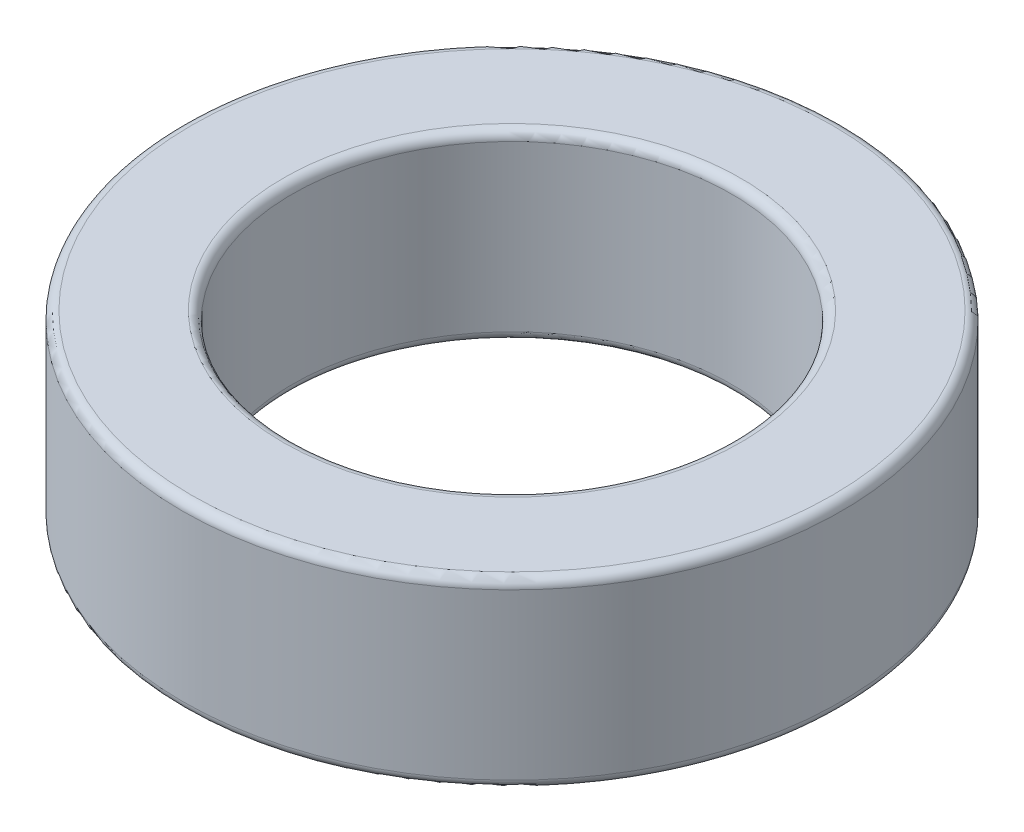
ISO-10303-21;
HEADER;
FILE_DESCRIPTION(('STEP AP214'),'2;1');
FILE_NAME('part.step','',(''),(''),'','','');
FILE_SCHEMA(('AUTOMOTIVE_DESIGN { 1 0 10303 214 1 1 1 1 }'));
ENDSEC;
DATA;
#1=APPLICATION_CONTEXT('core data for automotive mechanical design processes');
#2=APPLICATION_PROTOCOL_DEFINITION('international standard','automotive_design',2000,#1);
#3=PRODUCT_CONTEXT('',#1,'mechanical');
#4=PRODUCT('Part','Part','',(#3));
#5=PRODUCT_RELATED_PRODUCT_CATEGORY('part','',(#4));
#6=PRODUCT_DEFINITION_FORMATION('','',#4);
#7=PRODUCT_DEFINITION_CONTEXT('part definition',#1,'design');
#8=PRODUCT_DEFINITION('design','',#6,#7);
#9=PRODUCT_DEFINITION_SHAPE('','',#8);
#10=(LENGTH_UNIT() NAMED_UNIT(*) SI_UNIT(.MILLI.,.METRE.));
#11=(NAMED_UNIT(*) PLANE_ANGLE_UNIT() SI_UNIT($,.RADIAN.));
#12=(NAMED_UNIT(*) SI_UNIT($,.STERADIAN.) SOLID_ANGLE_UNIT());
#13=UNCERTAINTY_MEASURE_WITH_UNIT(LENGTH_MEASURE(1.E-05),#10,'distance_accuracy_value','');
#14=(GEOMETRIC_REPRESENTATION_CONTEXT(3) GLOBAL_UNCERTAINTY_ASSIGNED_CONTEXT((#13)) GLOBAL_UNIT_ASSIGNED_CONTEXT((#10,
#11,#12)) REPRESENTATION_CONTEXT('',''));
#15=CARTESIAN_POINT('',(0.,0.,0.));
#16=DIRECTION('',(0.,0.,1.));
#17=DIRECTION('',(1.,0.,0.));
#18=AXIS2_PLACEMENT_3D('',#15,#16,#17);
#19=CARTESIAN_POINT('',(0.,5.,0.));
#20=DIRECTION('',(0.,1.,0.));
#21=DIRECTION('',(0.,0.,1.));
#22=AXIS2_PLACEMENT_3D('',#19,#20,#21);
#23=PLANE('',#22);
#24=CARTESIAN_POINT('',(0.,5.,0.));
#25=DIRECTION('',(0.,1.,0.));
#26=DIRECTION('',(0.,0.,1.));
#27=AXIS2_PLACEMENT_3D('',#24,#25,#26);
#28=CIRCLE('',#27,6.25);
#29=CARTESIAN_POINT('',(0.,5.,6.25));
#30=VERTEX_POINT('',#29);
#31=EDGE_CURVE('E49',#30,#30,#28,.F.);
#32=ORIENTED_EDGE('',*,*,#31,.T.);
#33=EDGE_LOOP('',(#32));
#34=FACE_BOUND('',#33,.T.);
#35=CARTESIAN_POINT('',(0.,5.,0.));
#36=DIRECTION('',(0.,1.,0.));
#37=DIRECTION('',(0.,0.,1.));
#38=AXIS2_PLACEMENT_3D('',#35,#36,#37);
#39=CIRCLE('',#38,8.75);
#40=CARTESIAN_POINT('',(0.,5.,8.75));
#41=VERTEX_POINT('',#40);
#42=EDGE_CURVE('E53',#41,#41,#39,.T.);
#43=ORIENTED_EDGE('',*,*,#42,.T.);
#44=EDGE_LOOP('',(#43));
#45=FACE_BOUND('',#44,.T.);
#46=ADVANCED_FACE('F38',(#34,#45),#23,.T.);
#47=CARTESIAN_POINT('',(0.,0.,0.));
#48=DIRECTION('',(0.,1.,0.));
#49=DIRECTION('',(0.,0.,1.));
#50=AXIS2_PLACEMENT_3D('',#47,#48,#49);
#51=PLANE('',#50);
#52=CARTESIAN_POINT('',(0.,0.,0.));
#53=DIRECTION('',(0.,1.,0.));
#54=DIRECTION('',(0.,0.,1.));
#55=AXIS2_PLACEMENT_3D('',#52,#53,#54);
#56=CIRCLE('',#55,6.25);
#57=CARTESIAN_POINT('',(0.,0.,6.25));
#58=VERTEX_POINT('',#57);
#59=EDGE_CURVE('E64',#58,#58,#56,.T.);
#60=ORIENTED_EDGE('',*,*,#59,.T.);
#61=EDGE_LOOP('',(#60));
#62=FACE_BOUND('',#61,.T.);
#63=CARTESIAN_POINT('',(0.,0.,0.));
#64=DIRECTION('',(0.,1.,0.));
#65=DIRECTION('',(0.,0.,1.));
#66=AXIS2_PLACEMENT_3D('',#63,#64,#65);
#67=CIRCLE('',#66,8.75);
#68=CARTESIAN_POINT('',(0.,0.,8.75));
#69=VERTEX_POINT('',#68);
#70=EDGE_CURVE('E67',#69,#69,#67,.F.);
#71=ORIENTED_EDGE('',*,*,#70,.T.);
#72=EDGE_LOOP('',(#71));
#73=FACE_BOUND('',#72,.T.);
#74=ADVANCED_FACE('F71',(#62,#73),#51,.F.);
#75=CARTESIAN_POINT('',(0.,5.,0.));
#76=DIRECTION('',(0.,-1.,0.));
#77=DIRECTION('',(0.,0.,-1.));
#78=AXIS2_PLACEMENT_3D('',#75,#76,#77);
#79=CYLINDRICAL_SURFACE('',#78,9.);
#80=CARTESIAN_POINT('',(0.,0.25,0.));
#81=DIRECTION('',(0.,1.,0.));
#82=DIRECTION('',(0.,0.,1.));
#83=AXIS2_PLACEMENT_3D('',#80,#81,#82);
#84=CIRCLE('',#83,9.);
#85=CARTESIAN_POINT('',(0.,0.25,9.));
#86=VERTEX_POINT('',#85);
#87=EDGE_CURVE('E10',#86,#86,#84,.T.);
#88=ORIENTED_EDGE('',*,*,#87,.T.);
#89=EDGE_LOOP('',(#88));
#90=FACE_BOUND('',#89,.T.);
#91=CARTESIAN_POINT('',(0.,4.75,0.));
#92=DIRECTION('',(0.,1.,0.));
#93=DIRECTION('',(0.,0.,1.));
#94=AXIS2_PLACEMENT_3D('',#91,#92,#93);
#95=CIRCLE('',#94,9.);
#96=CARTESIAN_POINT('',(0.,4.75,9.));
#97=VERTEX_POINT('',#96);
#98=EDGE_CURVE('E45',#97,#97,#95,.F.);
#99=ORIENTED_EDGE('',*,*,#98,.T.);
#100=EDGE_LOOP('',(#99));
#101=FACE_BOUND('',#100,.T.);
#102=ADVANCED_FACE('F91',(#90,#101),#79,.T.);
#103=CARTESIAN_POINT('',(0.,5.,0.));
#104=DIRECTION('',(0.,-1.,0.));
#105=DIRECTION('',(0.,0.,-1.));
#106=AXIS2_PLACEMENT_3D('',#103,#104,#105);
#107=CYLINDRICAL_SURFACE('',#106,6.);
#108=CARTESIAN_POINT('',(0.,0.25,0.));
#109=DIRECTION('',(0.,1.,0.));
#110=DIRECTION('',(0.,0.,1.));
#111=AXIS2_PLACEMENT_3D('',#108,#109,#110);
#112=CIRCLE('',#111,6.);
#113=CARTESIAN_POINT('',(0.,0.25,6.));
#114=VERTEX_POINT('',#113);
#115=EDGE_CURVE('E58',#114,#114,#112,.F.);
#116=ORIENTED_EDGE('',*,*,#115,.T.);
#117=EDGE_LOOP('',(#116));
#118=FACE_BOUND('',#117,.T.);
#119=CARTESIAN_POINT('',(0.,4.75,0.));
#120=DIRECTION('',(0.,1.,0.));
#121=DIRECTION('',(0.,0.,1.));
#122=AXIS2_PLACEMENT_3D('',#119,#120,#121);
#123=CIRCLE('',#122,6.);
#124=CARTESIAN_POINT('',(0.,4.75,6.));
#125=VERTEX_POINT('',#124);
#126=EDGE_CURVE('E61',#125,#125,#123,.T.);
#127=ORIENTED_EDGE('',*,*,#126,.T.);
#128=EDGE_LOOP('',(#127));
#129=FACE_BOUND('',#128,.T.);
#130=ADVANCED_FACE('F96',(#118,#129),#107,.F.);
#131=CARTESIAN_POINT('',(0.,0.25,0.));
#132=DIRECTION('',(0.,1.,0.));
#133=DIRECTION('',(0.,0.,1.));
#134=AXIS2_PLACEMENT_3D('',#131,#132,#133);
#135=TOROIDAL_SURFACE('',#134,6.25,0.25);
#136=ORIENTED_EDGE('',*,*,#115,.F.);
#137=EDGE_LOOP('',(#136));
#138=FACE_BOUND('',#137,.T.);
#139=ORIENTED_EDGE('',*,*,#59,.F.);
#140=EDGE_LOOP('',(#139));
#141=FACE_BOUND('',#140,.T.);
#142=ADVANCED_FACE('F82',(#138,#141),#135,.T.);
#143=CARTESIAN_POINT('',(0.,4.75,0.));
#144=DIRECTION('',(0.,1.,0.));
#145=DIRECTION('',(0.,0.,1.));
#146=AXIS2_PLACEMENT_3D('',#143,#144,#145);
#147=TOROIDAL_SURFACE('',#146,6.25,0.25);
#148=ORIENTED_EDGE('',*,*,#31,.F.);
#149=EDGE_LOOP('',(#148));
#150=FACE_BOUND('',#149,.T.);
#151=ORIENTED_EDGE('',*,*,#126,.F.);
#152=EDGE_LOOP('',(#151));
#153=FACE_BOUND('',#152,.T.);
#154=ADVANCED_FACE('F76',(#150,#153),#147,.T.);
#155=CARTESIAN_POINT('',(0.,0.25,0.));
#156=DIRECTION('',(0.,1.,0.));
#157=DIRECTION('',(0.,0.,1.));
#158=AXIS2_PLACEMENT_3D('',#155,#156,#157);
#159=TOROIDAL_SURFACE('',#158,8.75,0.25);
#160=ORIENTED_EDGE('',*,*,#70,.F.);
#161=EDGE_LOOP('',(#160));
#162=FACE_BOUND('',#161,.T.);
#163=ORIENTED_EDGE('',*,*,#87,.F.);
#164=EDGE_LOOP('',(#163));
#165=FACE_BOUND('',#164,.T.);
#166=ADVANCED_FACE('F73',(#162,#165),#159,.T.);
#167=CARTESIAN_POINT('',(0.,4.75,0.));
#168=DIRECTION('',(0.,1.,0.));
#169=DIRECTION('',(0.,0.,1.));
#170=AXIS2_PLACEMENT_3D('',#167,#168,#169);
#171=TOROIDAL_SURFACE('',#170,8.75,0.25);
#172=ORIENTED_EDGE('',*,*,#98,.F.);
#173=EDGE_LOOP('',(#172));
#174=FACE_BOUND('',#173,.T.);
#175=ORIENTED_EDGE('',*,*,#42,.F.);
#176=EDGE_LOOP('',(#175));
#177=FACE_BOUND('',#176,.T.);
#178=ADVANCED_FACE('F40',(#174,#177),#171,.T.);
#179=CLOSED_SHELL('',(#46,#74,#102,#130,#142,#154,#166,#178));
#180=MANIFOLD_SOLID_BREP('B2',#179);
#181=ADVANCED_BREP_SHAPE_REPRESENTATION('',(#18,#180),#14);
#182=SHAPE_DEFINITION_REPRESENTATION(#9,#181);
ENDSEC;
END-ISO-10303-21;
